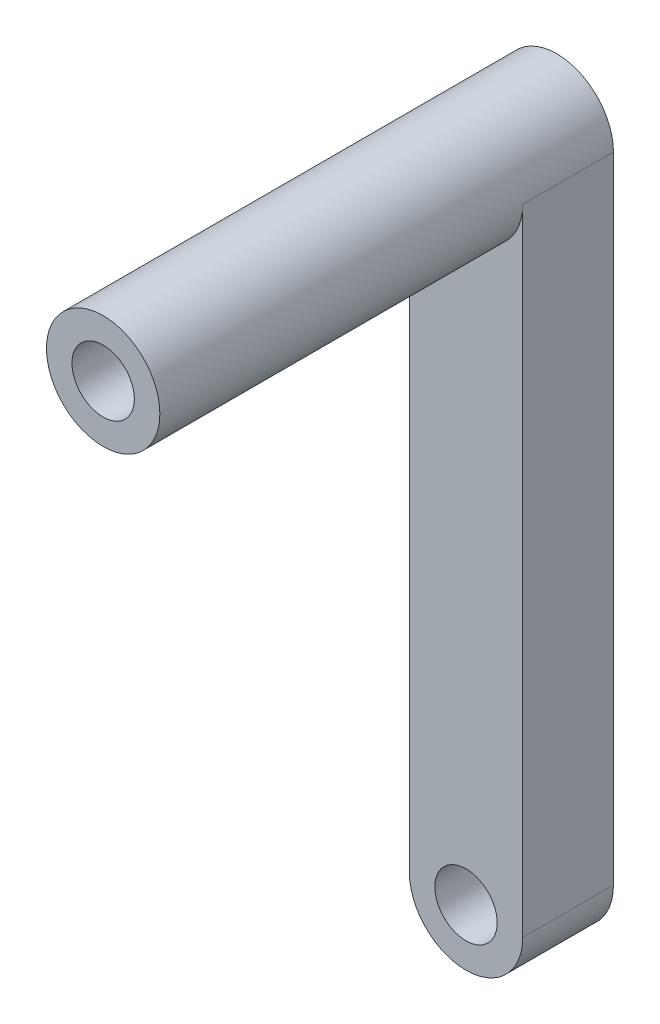
ISO-10303-21;
HEADER;
FILE_DESCRIPTION(('STEP AP214'),'2;1');
FILE_NAME('part.step','',(''),(''),'','','');
FILE_SCHEMA(('AUTOMOTIVE_DESIGN { 1 0 10303 214 1 1 1 1 }'));
ENDSEC;
DATA;
#1=APPLICATION_CONTEXT('core data for automotive mechanical design processes');
#2=APPLICATION_PROTOCOL_DEFINITION('international standard','automotive_design',2000,#1);
#3=PRODUCT_CONTEXT('',#1,'mechanical');
#4=PRODUCT('Part','Part','',(#3));
#5=PRODUCT_RELATED_PRODUCT_CATEGORY('part','',(#4));
#6=PRODUCT_DEFINITION_FORMATION('','',#4);
#7=PRODUCT_DEFINITION_CONTEXT('part definition',#1,'design');
#8=PRODUCT_DEFINITION('design','',#6,#7);
#9=PRODUCT_DEFINITION_SHAPE('','',#8);
#10=(LENGTH_UNIT() NAMED_UNIT(*) SI_UNIT(.MILLI.,.METRE.));
#11=(NAMED_UNIT(*) PLANE_ANGLE_UNIT() SI_UNIT($,.RADIAN.));
#12=(NAMED_UNIT(*) SI_UNIT($,.STERADIAN.) SOLID_ANGLE_UNIT());
#13=UNCERTAINTY_MEASURE_WITH_UNIT(LENGTH_MEASURE(1.E-05),#10,'distance_accuracy_value','');
#14=(GEOMETRIC_REPRESENTATION_CONTEXT(3) GLOBAL_UNCERTAINTY_ASSIGNED_CONTEXT((#13)) GLOBAL_UNIT_ASSIGNED_CONTEXT((#10,
#11,#12)) REPRESENTATION_CONTEXT('',''));
#15=CARTESIAN_POINT('',(0.,0.,0.));
#16=DIRECTION('',(0.,0.,1.));
#17=DIRECTION('',(1.,0.,0.));
#18=AXIS2_PLACEMENT_3D('',#15,#16,#17);
#19=CARTESIAN_POINT('',(2.5,0.,4.));
#20=DIRECTION('',(-1.,0.,0.));
#21=DIRECTION('',(0.,0.,1.));
#22=AXIS2_PLACEMENT_3D('',#19,#20,#21);
#23=PLANE('',#22);
#24=DIRECTION('',(0.,1.,0.));
#25=VECTOR('',#24,1.);
#26=CARTESIAN_POINT('',(2.5,0.,0.));
#27=LINE('',#26,#25);
#28=CARTESIAN_POINT('',(2.5,-10.1470588235294,0.));
#29=VERTEX_POINT('',#28);
#30=CARTESIAN_POINT('',(2.5,17.8529411764706,0.));
#31=VERTEX_POINT('',#30);
#32=EDGE_CURVE('E81',#29,#31,#27,.T.);
#33=ORIENTED_EDGE('',*,*,#32,.T.);
#34=DIRECTION('',(0.,0.,-1.));
#35=VECTOR('',#34,1.);
#36=CARTESIAN_POINT('',(2.5,17.8529411764706,4.));
#37=LINE('',#36,#35);
#38=CARTESIAN_POINT('',(2.5,17.8529411764706,4.));
#39=VERTEX_POINT('',#38);
#40=EDGE_CURVE('E11',#39,#31,#37,.T.);
#41=ORIENTED_EDGE('',*,*,#40,.F.);
#42=DIRECTION('',(0.,1.,0.));
#43=VECTOR('',#42,1.);
#44=CARTESIAN_POINT('',(2.5,0.,4.));
#45=LINE('',#44,#43);
#46=CARTESIAN_POINT('',(2.5,-10.1470588235294,4.));
#47=VERTEX_POINT('',#46);
#48=EDGE_CURVE('E82',#47,#39,#45,.T.);
#49=ORIENTED_EDGE('',*,*,#48,.F.);
#50=DIRECTION('',(0.,0.,-1.));
#51=VECTOR('',#50,1.);
#52=CARTESIAN_POINT('',(2.5,-10.1470588235294,4.));
#53=LINE('',#52,#51);
#54=EDGE_CURVE('E69',#47,#29,#53,.T.);
#55=ORIENTED_EDGE('',*,*,#54,.T.);
#56=EDGE_LOOP('',(#33,#41,#49,#55));
#57=FACE_BOUND('',#56,.T.);
#58=ADVANCED_FACE('F35',(#57),#23,.F.);
#59=CARTESIAN_POINT('',(-2.5,0.,4.));
#60=DIRECTION('',(-1.,0.,0.));
#61=DIRECTION('',(0.,0.,1.));
#62=AXIS2_PLACEMENT_3D('',#59,#60,#61);
#63=PLANE('',#62);
#64=DIRECTION('',(0.,1.,0.));
#65=VECTOR('',#64,1.);
#66=CARTESIAN_POINT('',(-2.5,0.,0.));
#67=LINE('',#66,#65);
#68=CARTESIAN_POINT('',(-2.5,-10.1470588235294,0.));
#69=VERTEX_POINT('',#68);
#70=CARTESIAN_POINT('',(-2.5,17.8529411764706,0.));
#71=VERTEX_POINT('',#70);
#72=EDGE_CURVE('E76',#69,#71,#67,.T.);
#73=ORIENTED_EDGE('',*,*,#72,.F.);
#74=DIRECTION('',(0.,0.,-1.));
#75=VECTOR('',#74,1.);
#76=CARTESIAN_POINT('',(-2.5,-10.1470588235294,4.));
#77=LINE('',#76,#75);
#78=CARTESIAN_POINT('',(-2.5,-10.1470588235294,4.));
#79=VERTEX_POINT('',#78);
#80=EDGE_CURVE('E64',#79,#69,#77,.T.);
#81=ORIENTED_EDGE('',*,*,#80,.F.);
#82=DIRECTION('',(0.,1.,0.));
#83=VECTOR('',#82,1.);
#84=CARTESIAN_POINT('',(-2.5,0.,4.));
#85=LINE('',#84,#83);
#86=CARTESIAN_POINT('',(-2.5,17.8529411764706,4.));
#87=VERTEX_POINT('',#86);
#88=EDGE_CURVE('E106',#79,#87,#85,.T.);
#89=ORIENTED_EDGE('',*,*,#88,.T.);
#90=DIRECTION('',(0.,0.,-1.));
#91=VECTOR('',#90,1.);
#92=CARTESIAN_POINT('',(-2.5,17.8529411764706,4.));
#93=LINE('',#92,#91);
#94=EDGE_CURVE('E43',#87,#71,#93,.T.);
#95=ORIENTED_EDGE('',*,*,#94,.T.);
#96=EDGE_LOOP('',(#73,#81,#89,#95));
#97=FACE_BOUND('',#96,.T.);
#98=ADVANCED_FACE('F105',(#97),#63,.T.);
#99=CARTESIAN_POINT('',(0.,-10.1470588235294,4.));
#100=DIRECTION('',(0.,0.,-1.));
#101=DIRECTION('',(-1.,0.,0.));
#102=AXIS2_PLACEMENT_3D('',#99,#100,#101);
#103=CYLINDRICAL_SURFACE('',#102,2.5);
#104=CARTESIAN_POINT('',(0.,-10.1470588235294,0.));
#105=DIRECTION('',(0.,0.,1.));
#106=DIRECTION('',(1.,0.,0.));
#107=AXIS2_PLACEMENT_3D('',#104,#105,#106);
#108=CIRCLE('',#107,2.5);
#109=EDGE_CURVE('E66',#69,#29,#108,.T.);
#110=ORIENTED_EDGE('',*,*,#109,.T.);
#111=ORIENTED_EDGE('',*,*,#54,.F.);
#112=CARTESIAN_POINT('',(0.,-10.1470588235294,4.));
#113=DIRECTION('',(0.,0.,1.));
#114=DIRECTION('',(1.,0.,0.));
#115=AXIS2_PLACEMENT_3D('',#112,#113,#114);
#116=CIRCLE('',#115,2.5);
#117=EDGE_CURVE('E51',#79,#47,#116,.T.);
#118=ORIENTED_EDGE('',*,*,#117,.F.);
#119=ORIENTED_EDGE('',*,*,#80,.T.);
#120=EDGE_LOOP('',(#110,#111,#118,#119));
#121=FACE_BOUND('',#120,.T.);
#122=ADVANCED_FACE('F68',(#121),#103,.T.);
#123=CARTESIAN_POINT('',(0.,-10.1470588235294,4.));
#124=DIRECTION('',(0.,0.,-1.));
#125=DIRECTION('',(-1.,0.,0.));
#126=AXIS2_PLACEMENT_3D('',#123,#124,#125);
#127=CYLINDRICAL_SURFACE('',#126,1.375);
#128=CARTESIAN_POINT('',(0.,-10.1470588235294,4.));
#129=DIRECTION('',(0.,0.,1.));
#130=DIRECTION('',(1.,0.,0.));
#131=AXIS2_PLACEMENT_3D('',#128,#129,#130);
#132=CIRCLE('',#131,1.375);
#133=CARTESIAN_POINT('',(1.375,-10.1470588235294,4.));
#134=VERTEX_POINT('',#133);
#135=EDGE_CURVE('E83',#134,#134,#132,.T.);
#136=ORIENTED_EDGE('',*,*,#135,.T.);
#137=EDGE_LOOP('',(#136));
#138=FACE_BOUND('',#137,.T.);
#139=CARTESIAN_POINT('',(0.,-10.1470588235294,0.));
#140=DIRECTION('',(0.,0.,1.));
#141=DIRECTION('',(1.,0.,0.));
#142=AXIS2_PLACEMENT_3D('',#139,#140,#141);
#143=CIRCLE('',#142,1.375);
#144=CARTESIAN_POINT('',(1.375,-10.1470588235294,0.));
#145=VERTEX_POINT('',#144);
#146=EDGE_CURVE('E75',#145,#145,#143,.T.);
#147=ORIENTED_EDGE('',*,*,#146,.F.);
#148=EDGE_LOOP('',(#147));
#149=FACE_BOUND('',#148,.T.);
#150=ADVANCED_FACE('F124',(#138,#149),#127,.F.);
#151=CARTESIAN_POINT('',(0.,0.,4.));
#152=DIRECTION('',(0.,0.,1.));
#153=DIRECTION('',(1.,0.,0.));
#154=AXIS2_PLACEMENT_3D('',#151,#152,#153);
#155=PLANE('',#154);
#156=ORIENTED_EDGE('',*,*,#48,.T.);
#157=CARTESIAN_POINT('',(0.,17.8529411764706,4.));
#158=DIRECTION('',(0.,0.,1.));
#159=DIRECTION('',(1.,0.,0.));
#160=AXIS2_PLACEMENT_3D('',#157,#158,#159);
#161=CIRCLE('',#160,2.5);
#162=EDGE_CURVE('E114',#87,#39,#161,.T.);
#163=ORIENTED_EDGE('',*,*,#162,.F.);
#164=ORIENTED_EDGE('',*,*,#88,.F.);
#165=ORIENTED_EDGE('',*,*,#117,.T.);
#166=EDGE_LOOP('',(#156,#163,#164,#165));
#167=FACE_BOUND('',#166,.T.);
#168=ORIENTED_EDGE('',*,*,#135,.F.);
#169=EDGE_LOOP('',(#168));
#170=FACE_BOUND('',#169,.T.);
#171=ADVANCED_FACE('F115',(#167,#170),#155,.T.);
#172=CARTESIAN_POINT('',(0.,0.,0.));
#173=DIRECTION('',(0.,0.,1.));
#174=DIRECTION('',(1.,0.,0.));
#175=AXIS2_PLACEMENT_3D('',#172,#173,#174);
#176=PLANE('',#175);
#177=ORIENTED_EDGE('',*,*,#32,.F.);
#178=ORIENTED_EDGE('',*,*,#109,.F.);
#179=ORIENTED_EDGE('',*,*,#72,.T.);
#180=CARTESIAN_POINT('',(0.,17.8529411764706,0.));
#181=DIRECTION('',(0.,0.,1.));
#182=DIRECTION('',(1.,0.,0.));
#183=AXIS2_PLACEMENT_3D('',#180,#181,#182);
#184=CIRCLE('',#183,2.5);
#185=EDGE_CURVE('E88',#31,#71,#184,.T.);
#186=ORIENTED_EDGE('',*,*,#185,.F.);
#187=EDGE_LOOP('',(#177,#178,#179,#186));
#188=FACE_BOUND('',#187,.T.);
#189=ORIENTED_EDGE('',*,*,#146,.T.);
#190=EDGE_LOOP('',(#189));
#191=FACE_BOUND('',#190,.T.);
#192=CARTESIAN_POINT('',(0.,17.8529411764706,0.));
#193=DIRECTION('',(0.,0.,1.));
#194=DIRECTION('',(1.,0.,0.));
#195=AXIS2_PLACEMENT_3D('',#192,#193,#194);
#196=CIRCLE('',#195,1.375);
#197=CARTESIAN_POINT('',(1.375,17.8529411764706,0.));
#198=VERTEX_POINT('',#197);
#199=EDGE_CURVE('E205',#198,#198,#196,.T.);
#200=ORIENTED_EDGE('',*,*,#199,.T.);
#201=EDGE_LOOP('',(#200));
#202=FACE_BOUND('',#201,.T.);
#203=ADVANCED_FACE('F85',(#188,#191,#202),#176,.F.);
#204=CARTESIAN_POINT('',(0.,17.8529411764706,20.));
#205=DIRECTION('',(0.,0.,-1.));
#206=DIRECTION('',(-1.,0.,0.));
#207=AXIS2_PLACEMENT_3D('',#204,#205,#206);
#208=CYLINDRICAL_SURFACE('',#207,1.375);
#209=CARTESIAN_POINT('',(0.,17.8529411764706,20.));
#210=DIRECTION('',(0.,0.,1.));
#211=DIRECTION('',(1.,0.,0.));
#212=AXIS2_PLACEMENT_3D('',#209,#210,#211);
#213=CIRCLE('',#212,1.375);
#214=CARTESIAN_POINT('',(1.375,17.8529411764706,20.));
#215=VERTEX_POINT('',#214);
#216=EDGE_CURVE('E93',#215,#215,#213,.T.);
#217=ORIENTED_EDGE('',*,*,#216,.T.);
#218=EDGE_LOOP('',(#217));
#219=FACE_BOUND('',#218,.T.);
#220=ORIENTED_EDGE('',*,*,#199,.F.);
#221=EDGE_LOOP('',(#220));
#222=FACE_BOUND('',#221,.T.);
#223=ADVANCED_FACE('F132',(#219,#222),#208,.F.);
#224=CARTESIAN_POINT('',(0.,17.8529411764706,20.));
#225=DIRECTION('',(0.,0.,-1.));
#226=DIRECTION('',(-1.,0.,0.));
#227=AXIS2_PLACEMENT_3D('',#224,#225,#226);
#228=CYLINDRICAL_SURFACE('',#227,2.5);
#229=ORIENTED_EDGE('',*,*,#40,.T.);
#230=ORIENTED_EDGE('',*,*,#185,.T.);
#231=ORIENTED_EDGE('',*,*,#94,.F.);
#232=ORIENTED_EDGE('',*,*,#162,.T.);
#233=EDGE_LOOP('',(#229,#230,#231,#232));
#234=FACE_BOUND('',#233,.T.);
#235=CARTESIAN_POINT('',(0.,17.8529411764706,20.));
#236=DIRECTION('',(0.,0.,1.));
#237=DIRECTION('',(1.,0.,0.));
#238=AXIS2_PLACEMENT_3D('',#235,#236,#237);
#239=CIRCLE('',#238,2.5);
#240=CARTESIAN_POINT('',(2.5,17.8529411764706,20.));
#241=VERTEX_POINT('',#240);
#242=EDGE_CURVE('E89',#241,#241,#239,.T.);
#243=ORIENTED_EDGE('',*,*,#242,.F.);
#244=EDGE_LOOP('',(#243));
#245=FACE_BOUND('',#244,.T.);
#246=ADVANCED_FACE('F112',(#234,#245),#228,.T.);
#247=CARTESIAN_POINT('',(0.,0.,20.));
#248=DIRECTION('',(0.,0.,1.));
#249=DIRECTION('',(1.,0.,0.));
#250=AXIS2_PLACEMENT_3D('',#247,#248,#249);
#251=PLANE('',#250);
#252=ORIENTED_EDGE('',*,*,#216,.F.);
#253=EDGE_LOOP('',(#252));
#254=FACE_BOUND('',#253,.T.);
#255=ORIENTED_EDGE('',*,*,#242,.T.);
#256=EDGE_LOOP('',(#255));
#257=FACE_BOUND('',#256,.T.);
#258=ADVANCED_FACE('F187',(#254,#257),#251,.T.);
#259=CLOSED_SHELL('',(#58,#98,#122,#150,#171,#203,#223,#246,#258));
#260=MANIFOLD_SOLID_BREP('B2',#259);
#261=ADVANCED_BREP_SHAPE_REPRESENTATION('',(#18,#260),#14);
#262=SHAPE_DEFINITION_REPRESENTATION(#9,#261);
ENDSEC;
END-ISO-10303-21;
